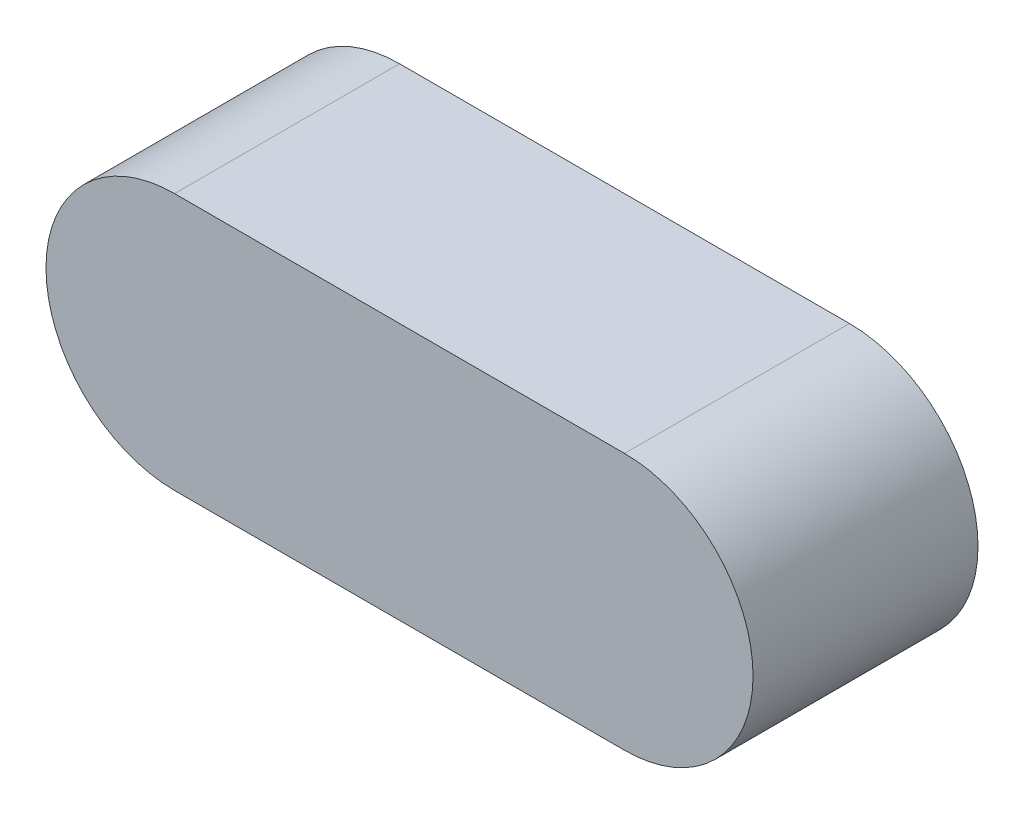
ISO-10303-21;
HEADER;
FILE_DESCRIPTION(('STEP AP214'),'2;1');
FILE_NAME('part.step','',(''),(''),'','','');
FILE_SCHEMA(('AUTOMOTIVE_DESIGN { 1 0 10303 214 1 1 1 1 }'));
ENDSEC;
DATA;
#1=APPLICATION_CONTEXT('core data for automotive mechanical design processes');
#2=APPLICATION_PROTOCOL_DEFINITION('international standard','automotive_design',2000,#1);
#3=PRODUCT_CONTEXT('',#1,'mechanical');
#4=PRODUCT('Part','Part','',(#3));
#5=PRODUCT_RELATED_PRODUCT_CATEGORY('part','',(#4));
#6=PRODUCT_DEFINITION_FORMATION('','',#4);
#7=PRODUCT_DEFINITION_CONTEXT('part definition',#1,'design');
#8=PRODUCT_DEFINITION('design','',#6,#7);
#9=PRODUCT_DEFINITION_SHAPE('','',#8);
#10=(LENGTH_UNIT() NAMED_UNIT(*) SI_UNIT(.MILLI.,.METRE.));
#11=(NAMED_UNIT(*) PLANE_ANGLE_UNIT() SI_UNIT($,.RADIAN.));
#12=(NAMED_UNIT(*) SI_UNIT($,.STERADIAN.) SOLID_ANGLE_UNIT());
#13=UNCERTAINTY_MEASURE_WITH_UNIT(LENGTH_MEASURE(1.E-05),#10,'distance_accuracy_value','');
#14=(GEOMETRIC_REPRESENTATION_CONTEXT(3) GLOBAL_UNCERTAINTY_ASSIGNED_CONTEXT((#13)) GLOBAL_UNIT_ASSIGNED_CONTEXT((#10,
#11,#12)) REPRESENTATION_CONTEXT('',''));
#15=CARTESIAN_POINT('',(0.,0.,0.));
#16=DIRECTION('',(0.,0.,1.));
#17=DIRECTION('',(1.,0.,0.));
#18=AXIS2_PLACEMENT_3D('',#15,#16,#17);
#19=CARTESIAN_POINT('',(0.,0.,7.));
#20=DIRECTION('',(0.,0.,-1.));
#21=DIRECTION('',(-1.,0.,0.));
#22=AXIS2_PLACEMENT_3D('',#19,#20,#21);
#23=CYLINDRICAL_SURFACE('',#22,4.);
#24=CARTESIAN_POINT('',(0.,0.,0.));
#25=DIRECTION('',(0.,0.,1.));
#26=DIRECTION('',(1.,0.,0.));
#27=AXIS2_PLACEMENT_3D('',#24,#25,#26);
#28=CIRCLE('',#27,4.);
#29=CARTESIAN_POINT('',(0.,4.,0.));
#30=VERTEX_POINT('',#29);
#31=CARTESIAN_POINT('',(0.,-4.,0.));
#32=VERTEX_POINT('',#31);
#33=EDGE_CURVE('E107',#30,#32,#28,.T.);
#34=ORIENTED_EDGE('',*,*,#33,.T.);
#35=DIRECTION('',(0.,0.,-1.));
#36=VECTOR('',#35,1.);
#37=CARTESIAN_POINT('',(0.,-4.,7.));
#38=LINE('',#37,#36);
#39=CARTESIAN_POINT('',(0.,-4.,7.));
#40=VERTEX_POINT('',#39);
#41=EDGE_CURVE('E11',#40,#32,#38,.T.);
#42=ORIENTED_EDGE('',*,*,#41,.F.);
#43=CARTESIAN_POINT('',(0.,0.,7.));
#44=DIRECTION('',(0.,0.,1.));
#45=DIRECTION('',(1.,0.,0.));
#46=AXIS2_PLACEMENT_3D('',#43,#44,#45);
#47=CIRCLE('',#46,4.);
#48=CARTESIAN_POINT('',(0.,4.,7.));
#49=VERTEX_POINT('',#48);
#50=EDGE_CURVE('E91',#49,#40,#47,.T.);
#51=ORIENTED_EDGE('',*,*,#50,.F.);
#52=DIRECTION('',(0.,0.,-1.));
#53=VECTOR('',#52,1.);
#54=CARTESIAN_POINT('',(0.,4.,7.));
#55=LINE('',#54,#53);
#56=EDGE_CURVE('E103',#49,#30,#55,.T.);
#57=ORIENTED_EDGE('',*,*,#56,.T.);
#58=EDGE_LOOP('',(#34,#42,#51,#57));
#59=FACE_BOUND('',#58,.T.);
#60=ADVANCED_FACE('F39',(#59),#23,.T.);
#61=CARTESIAN_POINT('',(0.,-4.,7.));
#62=DIRECTION('',(0.,1.,0.));
#63=DIRECTION('',(0.,0.,1.));
#64=AXIS2_PLACEMENT_3D('',#61,#62,#63);
#65=PLANE('',#64);
#66=DIRECTION('',(1.,0.,0.));
#67=VECTOR('',#66,1.);
#68=CARTESIAN_POINT('',(0.,-4.,0.));
#69=LINE('',#68,#67);
#70=CARTESIAN_POINT('',(14.,-4.,0.));
#71=VERTEX_POINT('',#70);
#72=EDGE_CURVE('E96',#32,#71,#69,.T.);
#73=ORIENTED_EDGE('',*,*,#72,.T.);
#74=DIRECTION('',(0.,0.,-1.));
#75=VECTOR('',#74,1.);
#76=CARTESIAN_POINT('',(14.,-4.,7.));
#77=LINE('',#76,#75);
#78=CARTESIAN_POINT('',(14.,-4.,7.));
#79=VERTEX_POINT('',#78);
#80=EDGE_CURVE('E48',#79,#71,#77,.T.);
#81=ORIENTED_EDGE('',*,*,#80,.F.);
#82=DIRECTION('',(1.,0.,0.));
#83=VECTOR('',#82,1.);
#84=CARTESIAN_POINT('',(0.,-4.,7.));
#85=LINE('',#84,#83);
#86=EDGE_CURVE('E86',#40,#79,#85,.T.);
#87=ORIENTED_EDGE('',*,*,#86,.F.);
#88=ORIENTED_EDGE('',*,*,#41,.T.);
#89=EDGE_LOOP('',(#73,#81,#87,#88));
#90=FACE_BOUND('',#89,.T.);
#91=ADVANCED_FACE('F95',(#90),#65,.F.);
#92=CARTESIAN_POINT('',(14.,0.,7.));
#93=DIRECTION('',(0.,0.,-1.));
#94=DIRECTION('',(-1.,0.,0.));
#95=AXIS2_PLACEMENT_3D('',#92,#93,#94);
#96=CYLINDRICAL_SURFACE('',#95,4.);
#97=CARTESIAN_POINT('',(14.,0.,0.));
#98=DIRECTION('',(0.,0.,1.));
#99=DIRECTION('',(1.,0.,0.));
#100=AXIS2_PLACEMENT_3D('',#97,#98,#99);
#101=CIRCLE('',#100,4.);
#102=CARTESIAN_POINT('',(14.,4.,0.));
#103=VERTEX_POINT('',#102);
#104=EDGE_CURVE('E73',#71,#103,#101,.T.);
#105=ORIENTED_EDGE('',*,*,#104,.T.);
#106=DIRECTION('',(0.,0.,-1.));
#107=VECTOR('',#106,1.);
#108=CARTESIAN_POINT('',(14.,4.,7.));
#109=LINE('',#108,#107);
#110=CARTESIAN_POINT('',(14.,4.,7.));
#111=VERTEX_POINT('',#110);
#112=EDGE_CURVE('E98',#111,#103,#109,.T.);
#113=ORIENTED_EDGE('',*,*,#112,.F.);
#114=CARTESIAN_POINT('',(14.,0.,7.));
#115=DIRECTION('',(0.,0.,1.));
#116=DIRECTION('',(1.,0.,0.));
#117=AXIS2_PLACEMENT_3D('',#114,#115,#116);
#118=CIRCLE('',#117,4.);
#119=EDGE_CURVE('E89',#79,#111,#118,.T.);
#120=ORIENTED_EDGE('',*,*,#119,.F.);
#121=ORIENTED_EDGE('',*,*,#80,.T.);
#122=EDGE_LOOP('',(#105,#113,#120,#121));
#123=FACE_BOUND('',#122,.T.);
#124=ADVANCED_FACE('F99',(#123),#96,.T.);
#125=CARTESIAN_POINT('',(0.,4.,7.));
#126=DIRECTION('',(0.,-1.,0.));
#127=DIRECTION('',(0.,0.,-1.));
#128=AXIS2_PLACEMENT_3D('',#125,#126,#127);
#129=PLANE('',#128);
#130=DIRECTION('',(-1.,0.,0.));
#131=VECTOR('',#130,1.);
#132=CARTESIAN_POINT('',(0.,4.,0.));
#133=LINE('',#132,#131);
#134=EDGE_CURVE('E79',#103,#30,#133,.T.);
#135=ORIENTED_EDGE('',*,*,#134,.T.);
#136=ORIENTED_EDGE('',*,*,#56,.F.);
#137=DIRECTION('',(-1.,0.,0.));
#138=VECTOR('',#137,1.);
#139=CARTESIAN_POINT('',(0.,4.,7.));
#140=LINE('',#139,#138);
#141=EDGE_CURVE('E56',#111,#49,#140,.T.);
#142=ORIENTED_EDGE('',*,*,#141,.F.);
#143=ORIENTED_EDGE('',*,*,#112,.T.);
#144=EDGE_LOOP('',(#135,#136,#142,#143));
#145=FACE_BOUND('',#144,.T.);
#146=ADVANCED_FACE('F120',(#145),#129,.F.);
#147=CARTESIAN_POINT('',(0.,0.,7.));
#148=DIRECTION('',(0.,0.,1.));
#149=DIRECTION('',(1.,0.,0.));
#150=AXIS2_PLACEMENT_3D('',#147,#148,#149);
#151=PLANE('',#150);
#152=ORIENTED_EDGE('',*,*,#50,.T.);
#153=ORIENTED_EDGE('',*,*,#86,.T.);
#154=ORIENTED_EDGE('',*,*,#119,.T.);
#155=ORIENTED_EDGE('',*,*,#141,.T.);
#156=EDGE_LOOP('',(#152,#153,#154,#155));
#157=FACE_BOUND('',#156,.T.);
#158=ADVANCED_FACE('F87',(#157),#151,.T.);
#159=CARTESIAN_POINT('',(0.,0.,0.));
#160=DIRECTION('',(0.,0.,1.));
#161=DIRECTION('',(1.,0.,0.));
#162=AXIS2_PLACEMENT_3D('',#159,#160,#161);
#163=PLANE('',#162);
#164=ORIENTED_EDGE('',*,*,#33,.F.);
#165=ORIENTED_EDGE('',*,*,#134,.F.);
#166=ORIENTED_EDGE('',*,*,#104,.F.);
#167=ORIENTED_EDGE('',*,*,#72,.F.);
#168=EDGE_LOOP('',(#164,#165,#166,#167));
#169=FACE_BOUND('',#168,.T.);
#170=ADVANCED_FACE('F123',(#169),#163,.F.);
#171=CLOSED_SHELL('',(#60,#91,#124,#146,#158,#170));
#172=MANIFOLD_SOLID_BREP('B2',#171);
#173=ADVANCED_BREP_SHAPE_REPRESENTATION('',(#18,#172),#14);
#174=SHAPE_DEFINITION_REPRESENTATION(#9,#173);
ENDSEC;
END-ISO-10303-21;
